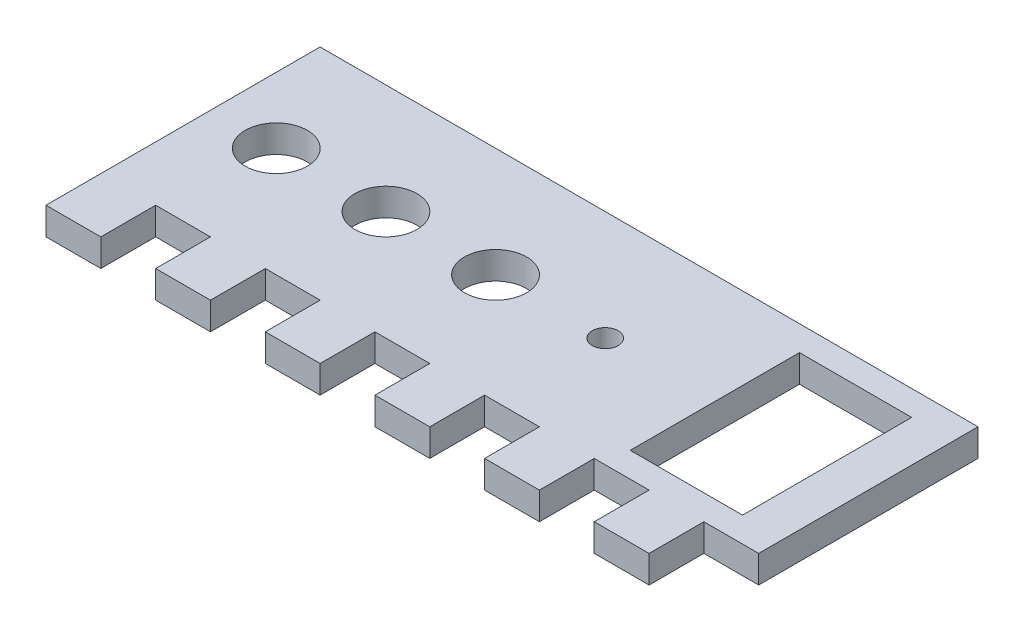
ISO-10303-21;
HEADER;
FILE_DESCRIPTION(('STEP AP214'),'2;1');
FILE_NAME('part.step','',(''),(''),'','','');
FILE_SCHEMA(('AUTOMOTIVE_DESIGN { 1 0 10303 214 1 1 1 1 }'));
ENDSEC;
DATA;
#1=APPLICATION_CONTEXT('core data for automotive mechanical design processes');
#2=APPLICATION_PROTOCOL_DEFINITION('international standard','automotive_design',2000,#1);
#3=PRODUCT_CONTEXT('',#1,'mechanical');
#4=PRODUCT('Part','Part','',(#3));
#5=PRODUCT_RELATED_PRODUCT_CATEGORY('part','',(#4));
#6=PRODUCT_DEFINITION_FORMATION('','',#4);
#7=PRODUCT_DEFINITION_CONTEXT('part definition',#1,'design');
#8=PRODUCT_DEFINITION('design','',#6,#7);
#9=PRODUCT_DEFINITION_SHAPE('','',#8);
#10=(LENGTH_UNIT() NAMED_UNIT(*) SI_UNIT(.MILLI.,.METRE.));
#11=(NAMED_UNIT(*) PLANE_ANGLE_UNIT() SI_UNIT($,.RADIAN.));
#12=(NAMED_UNIT(*) SI_UNIT($,.STERADIAN.) SOLID_ANGLE_UNIT());
#13=UNCERTAINTY_MEASURE_WITH_UNIT(LENGTH_MEASURE(1.E-05),#10,'distance_accuracy_value','');
#14=(GEOMETRIC_REPRESENTATION_CONTEXT(3) GLOBAL_UNCERTAINTY_ASSIGNED_CONTEXT((#13)) GLOBAL_UNIT_ASSIGNED_CONTEXT((#10,
#11,#12)) REPRESENTATION_CONTEXT('',''));
#15=CARTESIAN_POINT('',(0.,0.,0.));
#16=DIRECTION('',(0.,0.,1.));
#17=DIRECTION('',(1.,0.,0.));
#18=AXIS2_PLACEMENT_3D('',#15,#16,#17);
#19=CARTESIAN_POINT('',(0.,3.175,0.));
#20=DIRECTION('',(0.,-1.,0.));
#21=DIRECTION('',(0.,0.,-1.));
#22=AXIS2_PLACEMENT_3D('',#19,#20,#21);
#23=PLANE('',#22);
#24=CARTESIAN_POINT('',(7.62,3.175,-12.7));
#25=DIRECTION('',(0.,1.,0.));
#26=DIRECTION('',(0.,0.,1.));
#27=AXIS2_PLACEMENT_3D('',#24,#25,#26);
#28=CIRCLE('',#27,3.6);
#29=CARTESIAN_POINT('',(7.62,3.175,-9.1));
#30=VERTEX_POINT('',#29);
#31=EDGE_CURVE('E270',#30,#30,#28,.T.);
#32=ORIENTED_EDGE('',*,*,#31,.F.);
#33=EDGE_LOOP('',(#32));
#34=FACE_BOUND('',#33,.T.);
#35=CARTESIAN_POINT('',(45.72,3.175,-12.7));
#36=DIRECTION('',(0.,1.,0.));
#37=DIRECTION('',(0.,0.,1.));
#38=AXIS2_PLACEMENT_3D('',#35,#36,#37);
#39=CIRCLE('',#38,1.5);
#40=CARTESIAN_POINT('',(45.72,3.175,-11.2));
#41=VERTEX_POINT('',#40);
#42=EDGE_CURVE('E276',#41,#41,#39,.T.);
#43=ORIENTED_EDGE('',*,*,#42,.F.);
#44=EDGE_LOOP('',(#43));
#45=FACE_BOUND('',#44,.T.);
#46=CARTESIAN_POINT('',(33.02,3.175,-12.7));
#47=DIRECTION('',(0.,1.,0.));
#48=DIRECTION('',(0.,0.,1.));
#49=AXIS2_PLACEMENT_3D('',#46,#47,#48);
#50=CIRCLE('',#49,3.6);
#51=CARTESIAN_POINT('',(33.02,3.175,-9.1));
#52=VERTEX_POINT('',#51);
#53=EDGE_CURVE('E282',#52,#52,#50,.T.);
#54=ORIENTED_EDGE('',*,*,#53,.F.);
#55=EDGE_LOOP('',(#54));
#56=FACE_BOUND('',#55,.T.);
#57=CARTESIAN_POINT('',(20.32,3.175,-12.7));
#58=DIRECTION('',(0.,1.,0.));
#59=DIRECTION('',(0.,0.,1.));
#60=AXIS2_PLACEMENT_3D('',#57,#58,#59);
#61=CIRCLE('',#60,3.6);
#62=CARTESIAN_POINT('',(20.32,3.175,-9.1));
#63=VERTEX_POINT('',#62);
#64=EDGE_CURVE('E288',#63,#63,#61,.T.);
#65=ORIENTED_EDGE('',*,*,#64,.F.);
#66=EDGE_LOOP('',(#65));
#67=FACE_BOUND('',#66,.T.);
#68=DIRECTION('',(0.,0.,1.));
#69=VECTOR('',#68,1.);
#70=CARTESIAN_POINT('',(0.,3.175,0.));
#71=LINE('',#70,#69);
#72=CARTESIAN_POINT('',(0.,3.175,-25.4));
#73=VERTEX_POINT('',#72);
#74=CARTESIAN_POINT('',(0.,3.175,6.35));
#75=VERTEX_POINT('',#74);
#76=EDGE_CURVE('E294',#73,#75,#71,.T.);
#77=ORIENTED_EDGE('',*,*,#76,.T.);
#78=DIRECTION('',(1.,0.,0.));
#79=VECTOR('',#78,1.);
#80=CARTESIAN_POINT('',(0.,3.175,6.35));
#81=LINE('',#80,#79);
#82=CARTESIAN_POINT('',(6.35,3.175,6.35));
#83=VERTEX_POINT('',#82);
#84=EDGE_CURVE('E296',#75,#83,#81,.T.);
#85=ORIENTED_EDGE('',*,*,#84,.T.);
#86=DIRECTION('',(0.,0.,-1.));
#87=VECTOR('',#86,1.);
#88=CARTESIAN_POINT('',(6.35,3.175,6.35));
#89=LINE('',#88,#87);
#90=CARTESIAN_POINT('',(6.35,3.175,0.));
#91=VERTEX_POINT('',#90);
#92=EDGE_CURVE('E299',#83,#91,#89,.T.);
#93=ORIENTED_EDGE('',*,*,#92,.T.);
#94=DIRECTION('',(1.,0.,0.));
#95=VECTOR('',#94,1.);
#96=CARTESIAN_POINT('',(6.35,3.175,0.));
#97=LINE('',#96,#95);
#98=CARTESIAN_POINT('',(12.7,3.175,0.));
#99=VERTEX_POINT('',#98);
#100=EDGE_CURVE('E301',#91,#99,#97,.T.);
#101=ORIENTED_EDGE('',*,*,#100,.T.);
#102=DIRECTION('',(0.,0.,1.));
#103=VECTOR('',#102,1.);
#104=CARTESIAN_POINT('',(12.7,3.175,0.));
#105=LINE('',#104,#103);
#106=CARTESIAN_POINT('',(12.7,3.175,6.35));
#107=VERTEX_POINT('',#106);
#108=EDGE_CURVE('E303',#99,#107,#105,.T.);
#109=ORIENTED_EDGE('',*,*,#108,.T.);
#110=DIRECTION('',(1.,0.,0.));
#111=VECTOR('',#110,1.);
#112=CARTESIAN_POINT('',(12.7,3.175,6.35));
#113=LINE('',#112,#111);
#114=CARTESIAN_POINT('',(19.05,3.175,6.35));
#115=VERTEX_POINT('',#114);
#116=EDGE_CURVE('E305',#107,#115,#113,.T.);
#117=ORIENTED_EDGE('',*,*,#116,.T.);
#118=DIRECTION('',(0.,0.,-1.));
#119=VECTOR('',#118,1.);
#120=CARTESIAN_POINT('',(19.05,3.175,6.35));
#121=LINE('',#120,#119);
#122=CARTESIAN_POINT('',(19.05,3.175,0.));
#123=VERTEX_POINT('',#122);
#124=EDGE_CURVE('E307',#115,#123,#121,.T.);
#125=ORIENTED_EDGE('',*,*,#124,.T.);
#126=DIRECTION('',(1.,0.,0.));
#127=VECTOR('',#126,1.);
#128=CARTESIAN_POINT('',(19.05,3.175,0.));
#129=LINE('',#128,#127);
#130=CARTESIAN_POINT('',(25.4,3.175,0.));
#131=VERTEX_POINT('',#130);
#132=EDGE_CURVE('E309',#123,#131,#129,.T.);
#133=ORIENTED_EDGE('',*,*,#132,.T.);
#134=DIRECTION('',(0.,0.,1.));
#135=VECTOR('',#134,1.);
#136=CARTESIAN_POINT('',(25.4,3.175,0.));
#137=LINE('',#136,#135);
#138=CARTESIAN_POINT('',(25.4,3.175,6.35));
#139=VERTEX_POINT('',#138);
#140=EDGE_CURVE('E311',#131,#139,#137,.T.);
#141=ORIENTED_EDGE('',*,*,#140,.T.);
#142=DIRECTION('',(1.,0.,0.));
#143=VECTOR('',#142,1.);
#144=CARTESIAN_POINT('',(25.4,3.175,6.35));
#145=LINE('',#144,#143);
#146=CARTESIAN_POINT('',(31.75,3.175,6.35));
#147=VERTEX_POINT('',#146);
#148=EDGE_CURVE('E313',#139,#147,#145,.T.);
#149=ORIENTED_EDGE('',*,*,#148,.T.);
#150=DIRECTION('',(0.,0.,-1.));
#151=VECTOR('',#150,1.);
#152=CARTESIAN_POINT('',(31.75,3.175,6.35));
#153=LINE('',#152,#151);
#154=CARTESIAN_POINT('',(31.75,3.175,0.));
#155=VERTEX_POINT('',#154);
#156=EDGE_CURVE('E315',#147,#155,#153,.T.);
#157=ORIENTED_EDGE('',*,*,#156,.T.);
#158=DIRECTION('',(1.,0.,0.));
#159=VECTOR('',#158,1.);
#160=CARTESIAN_POINT('',(31.75,3.175,0.));
#161=LINE('',#160,#159);
#162=CARTESIAN_POINT('',(38.1,3.175,0.));
#163=VERTEX_POINT('',#162);
#164=EDGE_CURVE('E317',#155,#163,#161,.T.);
#165=ORIENTED_EDGE('',*,*,#164,.T.);
#166=DIRECTION('',(0.,0.,1.));
#167=VECTOR('',#166,1.);
#168=CARTESIAN_POINT('',(38.1,3.175,0.));
#169=LINE('',#168,#167);
#170=CARTESIAN_POINT('',(38.1,3.175,6.35));
#171=VERTEX_POINT('',#170);
#172=EDGE_CURVE('E319',#163,#171,#169,.T.);
#173=ORIENTED_EDGE('',*,*,#172,.T.);
#174=DIRECTION('',(1.,0.,0.));
#175=VECTOR('',#174,1.);
#176=CARTESIAN_POINT('',(38.1,3.175,6.35));
#177=LINE('',#176,#175);
#178=CARTESIAN_POINT('',(44.45,3.175,6.35));
#179=VERTEX_POINT('',#178);
#180=EDGE_CURVE('E321',#171,#179,#177,.T.);
#181=ORIENTED_EDGE('',*,*,#180,.T.);
#182=DIRECTION('',(0.,0.,-1.));
#183=VECTOR('',#182,1.);
#184=CARTESIAN_POINT('',(44.45,3.175,6.35));
#185=LINE('',#184,#183);
#186=CARTESIAN_POINT('',(44.45,3.175,0.));
#187=VERTEX_POINT('',#186);
#188=EDGE_CURVE('E323',#179,#187,#185,.T.);
#189=ORIENTED_EDGE('',*,*,#188,.T.);
#190=DIRECTION('',(1.,0.,0.));
#191=VECTOR('',#190,1.);
#192=CARTESIAN_POINT('',(44.45,3.175,0.));
#193=LINE('',#192,#191);
#194=CARTESIAN_POINT('',(50.8,3.175,0.));
#195=VERTEX_POINT('',#194);
#196=EDGE_CURVE('E325',#187,#195,#193,.T.);
#197=ORIENTED_EDGE('',*,*,#196,.T.);
#198=DIRECTION('',(0.,0.,1.));
#199=VECTOR('',#198,1.);
#200=CARTESIAN_POINT('',(50.8,3.175,0.));
#201=LINE('',#200,#199);
#202=CARTESIAN_POINT('',(50.8,3.175,6.35));
#203=VERTEX_POINT('',#202);
#204=EDGE_CURVE('E327',#195,#203,#201,.T.);
#205=ORIENTED_EDGE('',*,*,#204,.T.);
#206=DIRECTION('',(1.,0.,0.));
#207=VECTOR('',#206,1.);
#208=CARTESIAN_POINT('',(50.8,3.175,6.35));
#209=LINE('',#208,#207);
#210=CARTESIAN_POINT('',(57.15,3.175,6.35));
#211=VERTEX_POINT('',#210);
#212=EDGE_CURVE('E329',#203,#211,#209,.T.);
#213=ORIENTED_EDGE('',*,*,#212,.T.);
#214=DIRECTION('',(0.,0.,-1.));
#215=VECTOR('',#214,1.);
#216=CARTESIAN_POINT('',(57.15,3.175,6.35));
#217=LINE('',#216,#215);
#218=CARTESIAN_POINT('',(57.15,3.175,0.));
#219=VERTEX_POINT('',#218);
#220=EDGE_CURVE('E331',#211,#219,#217,.T.);
#221=ORIENTED_EDGE('',*,*,#220,.T.);
#222=DIRECTION('',(1.,0.,0.));
#223=VECTOR('',#222,1.);
#224=CARTESIAN_POINT('',(57.15,3.175,0.));
#225=LINE('',#224,#223);
#226=CARTESIAN_POINT('',(63.5,3.175,0.));
#227=VERTEX_POINT('',#226);
#228=EDGE_CURVE('E333',#219,#227,#225,.T.);
#229=ORIENTED_EDGE('',*,*,#228,.T.);
#230=DIRECTION('',(0.,0.,1.));
#231=VECTOR('',#230,1.);
#232=CARTESIAN_POINT('',(63.5,3.175,0.));
#233=LINE('',#232,#231);
#234=CARTESIAN_POINT('',(63.5,3.175,6.35));
#235=VERTEX_POINT('',#234);
#236=EDGE_CURVE('E335',#227,#235,#233,.T.);
#237=ORIENTED_EDGE('',*,*,#236,.T.);
#238=DIRECTION('',(1.,0.,0.));
#239=VECTOR('',#238,1.);
#240=CARTESIAN_POINT('',(63.5,3.175,6.35));
#241=LINE('',#240,#239);
#242=CARTESIAN_POINT('',(69.85,3.175,6.35));
#243=VERTEX_POINT('',#242);
#244=EDGE_CURVE('E337',#235,#243,#241,.T.);
#245=ORIENTED_EDGE('',*,*,#244,.T.);
#246=DIRECTION('',(0.,0.,-1.));
#247=VECTOR('',#246,1.);
#248=CARTESIAN_POINT('',(69.85,3.175,6.35));
#249=LINE('',#248,#247);
#250=CARTESIAN_POINT('',(69.85,3.175,0.));
#251=VERTEX_POINT('',#250);
#252=EDGE_CURVE('E339',#243,#251,#249,.T.);
#253=ORIENTED_EDGE('',*,*,#252,.T.);
#254=DIRECTION('',(1.,0.,0.));
#255=VECTOR('',#254,1.);
#256=CARTESIAN_POINT('',(69.85,3.175,0.));
#257=LINE('',#256,#255);
#258=CARTESIAN_POINT('',(76.2,3.175,0.));
#259=VERTEX_POINT('',#258);
#260=EDGE_CURVE('E341',#251,#259,#257,.T.);
#261=ORIENTED_EDGE('',*,*,#260,.T.);
#262=DIRECTION('',(0.,0.,-1.));
#263=VECTOR('',#262,1.);
#264=CARTESIAN_POINT('',(76.2,3.175,0.));
#265=LINE('',#264,#263);
#266=CARTESIAN_POINT('',(76.2,3.175,-25.4));
#267=VERTEX_POINT('',#266);
#268=EDGE_CURVE('E343',#259,#267,#265,.T.);
#269=ORIENTED_EDGE('',*,*,#268,.T.);
#270=DIRECTION('',(-1.,0.,0.));
#271=VECTOR('',#270,1.);
#272=CARTESIAN_POINT('',(0.,3.175,-25.4));
#273=LINE('',#272,#271);
#274=EDGE_CURVE('E345',#267,#73,#273,.T.);
#275=ORIENTED_EDGE('',*,*,#274,.T.);
#276=EDGE_LOOP('',(#77,#85,#93,#101,#109,#117,#125,#133,#141,#149,#157,#165,#173,#181,#189,#197,
#205,#213,#221,#229,#237,#245,#253,#261,#269,#275));
#277=FACE_BOUND('',#276,.T.);
#278=DIRECTION('',(0.,0.,1.));
#279=VECTOR('',#278,1.);
#280=CARTESIAN_POINT('',(58.42,3.175,-22.5));
#281=LINE('',#280,#279);
#282=CARTESIAN_POINT('',(58.42,3.175,-22.5));
#283=VERTEX_POINT('',#282);
#284=CARTESIAN_POINT('',(58.42,3.175,-2.9));
#285=VERTEX_POINT('',#284);
#286=EDGE_CURVE('E234',#283,#285,#281,.T.);
#287=ORIENTED_EDGE('',*,*,#286,.F.);
#288=DIRECTION('',(-1.,0.,0.));
#289=VECTOR('',#288,1.);
#290=CARTESIAN_POINT('',(58.42,3.175,-22.5));
#291=LINE('',#290,#289);
#292=CARTESIAN_POINT('',(71.42,3.175,-22.5));
#293=VERTEX_POINT('',#292);
#294=EDGE_CURVE('E256',#293,#283,#291,.T.);
#295=ORIENTED_EDGE('',*,*,#294,.F.);
#296=DIRECTION('',(0.,0.,-1.));
#297=VECTOR('',#296,1.);
#298=CARTESIAN_POINT('',(71.42,3.175,-22.5));
#299=LINE('',#298,#297);
#300=CARTESIAN_POINT('',(71.42,3.175,-2.9));
#301=VERTEX_POINT('',#300);
#302=EDGE_CURVE('E254',#301,#293,#299,.T.);
#303=ORIENTED_EDGE('',*,*,#302,.F.);
#304=DIRECTION('',(1.,0.,0.));
#305=VECTOR('',#304,1.);
#306=CARTESIAN_POINT('',(58.42,3.175,-2.9));
#307=LINE('',#306,#305);
#308=EDGE_CURVE('E242',#285,#301,#307,.T.);
#309=ORIENTED_EDGE('',*,*,#308,.F.);
#310=EDGE_LOOP('',(#287,#295,#303,#309));
#311=FACE_BOUND('',#310,.T.);
#312=ADVANCED_FACE('F37',(#34,#45,#56,#67,#277,#311),#23,.F.);
#313=CARTESIAN_POINT('',(0.,0.,0.));
#314=DIRECTION('',(0.,-1.,0.));
#315=DIRECTION('',(0.,0.,-1.));
#316=AXIS2_PLACEMENT_3D('',#313,#314,#315);
#317=PLANE('',#316);
#318=CARTESIAN_POINT('',(45.72,0.,-12.7));
#319=DIRECTION('',(0.,1.,0.));
#320=DIRECTION('',(0.,0.,1.));
#321=AXIS2_PLACEMENT_3D('',#318,#319,#320);
#322=CIRCLE('',#321,1.5);
#323=CARTESIAN_POINT('',(45.72,0.,-11.2));
#324=VERTEX_POINT('',#323);
#325=EDGE_CURVE('E273',#324,#324,#322,.T.);
#326=ORIENTED_EDGE('',*,*,#325,.T.);
#327=EDGE_LOOP('',(#326));
#328=FACE_BOUND('',#327,.T.);
#329=CARTESIAN_POINT('',(20.32,0.,-12.7));
#330=DIRECTION('',(0.,1.,0.));
#331=DIRECTION('',(0.,0.,1.));
#332=AXIS2_PLACEMENT_3D('',#329,#330,#331);
#333=CIRCLE('',#332,3.6);
#334=CARTESIAN_POINT('',(20.32,0.,-9.1));
#335=VERTEX_POINT('',#334);
#336=EDGE_CURVE('E285',#335,#335,#333,.T.);
#337=ORIENTED_EDGE('',*,*,#336,.T.);
#338=EDGE_LOOP('',(#337));
#339=FACE_BOUND('',#338,.T.);
#340=DIRECTION('',(0.,0.,1.));
#341=VECTOR('',#340,1.);
#342=CARTESIAN_POINT('',(0.,0.,0.));
#343=LINE('',#342,#341);
#344=CARTESIAN_POINT('',(0.,0.,-25.4));
#345=VERTEX_POINT('',#344);
#346=CARTESIAN_POINT('',(0.,0.,6.35));
#347=VERTEX_POINT('',#346);
#348=EDGE_CURVE('E291',#345,#347,#343,.T.);
#349=ORIENTED_EDGE('',*,*,#348,.F.);
#350=DIRECTION('',(-1.,0.,0.));
#351=VECTOR('',#350,1.);
#352=CARTESIAN_POINT('',(0.,0.,-25.4));
#353=LINE('',#352,#351);
#354=CARTESIAN_POINT('',(76.2,0.,-25.4));
#355=VERTEX_POINT('',#354);
#356=EDGE_CURVE('E297',#355,#345,#353,.T.);
#357=ORIENTED_EDGE('',*,*,#356,.F.);
#358=DIRECTION('',(0.,0.,-1.));
#359=VECTOR('',#358,1.);
#360=CARTESIAN_POINT('',(76.2,0.,0.));
#361=LINE('',#360,#359);
#362=CARTESIAN_POINT('',(76.2,0.,0.));
#363=VERTEX_POINT('',#362);
#364=EDGE_CURVE('E395',#363,#355,#361,.T.);
#365=ORIENTED_EDGE('',*,*,#364,.F.);
#366=DIRECTION('',(1.,0.,0.));
#367=VECTOR('',#366,1.);
#368=CARTESIAN_POINT('',(69.85,0.,0.));
#369=LINE('',#368,#367);
#370=CARTESIAN_POINT('',(69.85,0.,0.));
#371=VERTEX_POINT('',#370);
#372=EDGE_CURVE('E393',#371,#363,#369,.T.);
#373=ORIENTED_EDGE('',*,*,#372,.F.);
#374=DIRECTION('',(0.,0.,-1.));
#375=VECTOR('',#374,1.);
#376=CARTESIAN_POINT('',(69.85,0.,6.35));
#377=LINE('',#376,#375);
#378=CARTESIAN_POINT('',(69.85,0.,6.35));
#379=VERTEX_POINT('',#378);
#380=EDGE_CURVE('E391',#379,#371,#377,.T.);
#381=ORIENTED_EDGE('',*,*,#380,.F.);
#382=DIRECTION('',(1.,0.,0.));
#383=VECTOR('',#382,1.);
#384=CARTESIAN_POINT('',(63.5,0.,6.35));
#385=LINE('',#384,#383);
#386=CARTESIAN_POINT('',(63.5,0.,6.35));
#387=VERTEX_POINT('',#386);
#388=EDGE_CURVE('E389',#387,#379,#385,.T.);
#389=ORIENTED_EDGE('',*,*,#388,.F.);
#390=DIRECTION('',(0.,0.,1.));
#391=VECTOR('',#390,1.);
#392=CARTESIAN_POINT('',(63.5,0.,0.));
#393=LINE('',#392,#391);
#394=CARTESIAN_POINT('',(63.5,0.,0.));
#395=VERTEX_POINT('',#394);
#396=EDGE_CURVE('E387',#395,#387,#393,.T.);
#397=ORIENTED_EDGE('',*,*,#396,.F.);
#398=DIRECTION('',(1.,0.,0.));
#399=VECTOR('',#398,1.);
#400=CARTESIAN_POINT('',(57.15,0.,0.));
#401=LINE('',#400,#399);
#402=CARTESIAN_POINT('',(57.15,0.,0.));
#403=VERTEX_POINT('',#402);
#404=EDGE_CURVE('E385',#403,#395,#401,.T.);
#405=ORIENTED_EDGE('',*,*,#404,.F.);
#406=DIRECTION('',(0.,0.,-1.));
#407=VECTOR('',#406,1.);
#408=CARTESIAN_POINT('',(57.15,0.,6.35));
#409=LINE('',#408,#407);
#410=CARTESIAN_POINT('',(57.15,0.,6.35));
#411=VERTEX_POINT('',#410);
#412=EDGE_CURVE('E383',#411,#403,#409,.T.);
#413=ORIENTED_EDGE('',*,*,#412,.F.);
#414=DIRECTION('',(1.,0.,0.));
#415=VECTOR('',#414,1.);
#416=CARTESIAN_POINT('',(50.8,0.,6.35));
#417=LINE('',#416,#415);
#418=CARTESIAN_POINT('',(50.8,0.,6.35));
#419=VERTEX_POINT('',#418);
#420=EDGE_CURVE('E381',#419,#411,#417,.T.);
#421=ORIENTED_EDGE('',*,*,#420,.F.);
#422=DIRECTION('',(0.,0.,1.));
#423=VECTOR('',#422,1.);
#424=CARTESIAN_POINT('',(50.8,0.,0.));
#425=LINE('',#424,#423);
#426=CARTESIAN_POINT('',(50.8,0.,0.));
#427=VERTEX_POINT('',#426);
#428=EDGE_CURVE('E379',#427,#419,#425,.T.);
#429=ORIENTED_EDGE('',*,*,#428,.F.);
#430=DIRECTION('',(1.,0.,0.));
#431=VECTOR('',#430,1.);
#432=CARTESIAN_POINT('',(44.45,0.,0.));
#433=LINE('',#432,#431);
#434=CARTESIAN_POINT('',(44.45,0.,0.));
#435=VERTEX_POINT('',#434);
#436=EDGE_CURVE('E377',#435,#427,#433,.T.);
#437=ORIENTED_EDGE('',*,*,#436,.F.);
#438=DIRECTION('',(0.,0.,-1.));
#439=VECTOR('',#438,1.);
#440=CARTESIAN_POINT('',(44.45,0.,6.35));
#441=LINE('',#440,#439);
#442=CARTESIAN_POINT('',(44.45,0.,6.35));
#443=VERTEX_POINT('',#442);
#444=EDGE_CURVE('E375',#443,#435,#441,.T.);
#445=ORIENTED_EDGE('',*,*,#444,.F.);
#446=DIRECTION('',(1.,0.,0.));
#447=VECTOR('',#446,1.);
#448=CARTESIAN_POINT('',(38.1,0.,6.35));
#449=LINE('',#448,#447);
#450=CARTESIAN_POINT('',(38.1,0.,6.35));
#451=VERTEX_POINT('',#450);
#452=EDGE_CURVE('E373',#451,#443,#449,.T.);
#453=ORIENTED_EDGE('',*,*,#452,.F.);
#454=DIRECTION('',(0.,0.,1.));
#455=VECTOR('',#454,1.);
#456=CARTESIAN_POINT('',(38.1,0.,0.));
#457=LINE('',#456,#455);
#458=CARTESIAN_POINT('',(38.1,0.,0.));
#459=VERTEX_POINT('',#458);
#460=EDGE_CURVE('E371',#459,#451,#457,.T.);
#461=ORIENTED_EDGE('',*,*,#460,.F.);
#462=DIRECTION('',(1.,0.,0.));
#463=VECTOR('',#462,1.);
#464=CARTESIAN_POINT('',(31.75,0.,0.));
#465=LINE('',#464,#463);
#466=CARTESIAN_POINT('',(31.75,0.,0.));
#467=VERTEX_POINT('',#466);
#468=EDGE_CURVE('E369',#467,#459,#465,.T.);
#469=ORIENTED_EDGE('',*,*,#468,.F.);
#470=DIRECTION('',(0.,0.,-1.));
#471=VECTOR('',#470,1.);
#472=CARTESIAN_POINT('',(31.75,0.,6.35));
#473=LINE('',#472,#471);
#474=CARTESIAN_POINT('',(31.75,0.,6.35));
#475=VERTEX_POINT('',#474);
#476=EDGE_CURVE('E367',#475,#467,#473,.T.);
#477=ORIENTED_EDGE('',*,*,#476,.F.);
#478=DIRECTION('',(1.,0.,0.));
#479=VECTOR('',#478,1.);
#480=CARTESIAN_POINT('',(25.4,0.,6.35));
#481=LINE('',#480,#479);
#482=CARTESIAN_POINT('',(25.4,0.,6.35));
#483=VERTEX_POINT('',#482);
#484=EDGE_CURVE('E365',#483,#475,#481,.T.);
#485=ORIENTED_EDGE('',*,*,#484,.F.);
#486=DIRECTION('',(0.,0.,1.));
#487=VECTOR('',#486,1.);
#488=CARTESIAN_POINT('',(25.4,0.,0.));
#489=LINE('',#488,#487);
#490=CARTESIAN_POINT('',(25.4,0.,0.));
#491=VERTEX_POINT('',#490);
#492=EDGE_CURVE('E363',#491,#483,#489,.T.);
#493=ORIENTED_EDGE('',*,*,#492,.F.);
#494=DIRECTION('',(1.,0.,0.));
#495=VECTOR('',#494,1.);
#496=CARTESIAN_POINT('',(19.05,0.,0.));
#497=LINE('',#496,#495);
#498=CARTESIAN_POINT('',(19.05,0.,0.));
#499=VERTEX_POINT('',#498);
#500=EDGE_CURVE('E361',#499,#491,#497,.T.);
#501=ORIENTED_EDGE('',*,*,#500,.F.);
#502=DIRECTION('',(0.,0.,-1.));
#503=VECTOR('',#502,1.);
#504=CARTESIAN_POINT('',(19.05,0.,6.35));
#505=LINE('',#504,#503);
#506=CARTESIAN_POINT('',(19.05,0.,6.35));
#507=VERTEX_POINT('',#506);
#508=EDGE_CURVE('E359',#507,#499,#505,.T.);
#509=ORIENTED_EDGE('',*,*,#508,.F.);
#510=DIRECTION('',(1.,0.,0.));
#511=VECTOR('',#510,1.);
#512=CARTESIAN_POINT('',(12.7,0.,6.35));
#513=LINE('',#512,#511);
#514=CARTESIAN_POINT('',(12.7,0.,6.35));
#515=VERTEX_POINT('',#514);
#516=EDGE_CURVE('E357',#515,#507,#513,.T.);
#517=ORIENTED_EDGE('',*,*,#516,.F.);
#518=DIRECTION('',(0.,0.,1.));
#519=VECTOR('',#518,1.);
#520=CARTESIAN_POINT('',(12.7,0.,0.));
#521=LINE('',#520,#519);
#522=CARTESIAN_POINT('',(12.7,0.,0.));
#523=VERTEX_POINT('',#522);
#524=EDGE_CURVE('E355',#523,#515,#521,.T.);
#525=ORIENTED_EDGE('',*,*,#524,.F.);
#526=DIRECTION('',(1.,0.,0.));
#527=VECTOR('',#526,1.);
#528=CARTESIAN_POINT('',(6.35,0.,0.));
#529=LINE('',#528,#527);
#530=CARTESIAN_POINT('',(6.35,0.,0.));
#531=VERTEX_POINT('',#530);
#532=EDGE_CURVE('E353',#531,#523,#529,.T.);
#533=ORIENTED_EDGE('',*,*,#532,.F.);
#534=DIRECTION('',(0.,0.,-1.));
#535=VECTOR('',#534,1.);
#536=CARTESIAN_POINT('',(6.35,0.,6.35));
#537=LINE('',#536,#535);
#538=CARTESIAN_POINT('',(6.35,0.,6.35));
#539=VERTEX_POINT('',#538);
#540=EDGE_CURVE('E351',#539,#531,#537,.T.);
#541=ORIENTED_EDGE('',*,*,#540,.F.);
#542=DIRECTION('',(1.,0.,0.));
#543=VECTOR('',#542,1.);
#544=CARTESIAN_POINT('',(0.,0.,6.35));
#545=LINE('',#544,#543);
#546=EDGE_CURVE('E349',#347,#539,#545,.T.);
#547=ORIENTED_EDGE('',*,*,#546,.F.);
#548=EDGE_LOOP('',(#349,#357,#365,#373,#381,#389,#397,#405,#413,#421,#429,#437,#445,#453,#461,
#469,#477,#485,#493,#501,#509,#517,#525,#533,#541,#547));
#549=FACE_BOUND('',#548,.T.);
#550=CARTESIAN_POINT('',(33.02,0.,-12.7));
#551=DIRECTION('',(0.,1.,0.));
#552=DIRECTION('',(0.,0.,1.));
#553=AXIS2_PLACEMENT_3D('',#550,#551,#552);
#554=CIRCLE('',#553,3.6);
#555=CARTESIAN_POINT('',(33.02,0.,-9.1));
#556=VERTEX_POINT('',#555);
#557=EDGE_CURVE('E279',#556,#556,#554,.T.);
#558=ORIENTED_EDGE('',*,*,#557,.T.);
#559=EDGE_LOOP('',(#558));
#560=FACE_BOUND('',#559,.T.);
#561=CARTESIAN_POINT('',(7.62,0.,-12.7));
#562=DIRECTION('',(0.,1.,0.));
#563=DIRECTION('',(0.,0.,1.));
#564=AXIS2_PLACEMENT_3D('',#561,#562,#563);
#565=CIRCLE('',#564,3.6);
#566=CARTESIAN_POINT('',(7.62,0.,-9.1));
#567=VERTEX_POINT('',#566);
#568=EDGE_CURVE('E250',#567,#567,#565,.T.);
#569=ORIENTED_EDGE('',*,*,#568,.T.);
#570=EDGE_LOOP('',(#569));
#571=FACE_BOUND('',#570,.T.);
#572=DIRECTION('',(-1.,0.,0.));
#573=VECTOR('',#572,1.);
#574=CARTESIAN_POINT('',(58.42,0.,-22.5));
#575=LINE('',#574,#573);
#576=CARTESIAN_POINT('',(71.42,0.,-22.5));
#577=VERTEX_POINT('',#576);
#578=CARTESIAN_POINT('',(58.42,0.,-22.5));
#579=VERTEX_POINT('',#578);
#580=EDGE_CURVE('E243',#577,#579,#575,.T.);
#581=ORIENTED_EDGE('',*,*,#580,.T.);
#582=DIRECTION('',(0.,0.,1.));
#583=VECTOR('',#582,1.);
#584=CARTESIAN_POINT('',(58.42,0.,-22.5));
#585=LINE('',#584,#583);
#586=CARTESIAN_POINT('',(58.42,0.,-2.9));
#587=VERTEX_POINT('',#586);
#588=EDGE_CURVE('E60',#579,#587,#585,.T.);
#589=ORIENTED_EDGE('',*,*,#588,.T.);
#590=DIRECTION('',(1.,0.,0.));
#591=VECTOR('',#590,1.);
#592=CARTESIAN_POINT('',(58.42,0.,-2.9));
#593=LINE('',#592,#591);
#594=CARTESIAN_POINT('',(71.42,0.,-2.9));
#595=VERTEX_POINT('',#594);
#596=EDGE_CURVE('E249',#587,#595,#593,.T.);
#597=ORIENTED_EDGE('',*,*,#596,.T.);
#598=DIRECTION('',(0.,0.,-1.));
#599=VECTOR('',#598,1.);
#600=CARTESIAN_POINT('',(71.42,0.,-22.5));
#601=LINE('',#600,#599);
#602=EDGE_CURVE('E262',#595,#577,#601,.T.);
#603=ORIENTED_EDGE('',*,*,#602,.T.);
#604=EDGE_LOOP('',(#581,#589,#597,#603));
#605=FACE_BOUND('',#604,.T.);
#606=ADVANCED_FACE('F481',(#328,#339,#549,#560,#571,#605),#317,.T.);
#607=CARTESIAN_POINT('',(0.,3.175,0.));
#608=DIRECTION('',(1.,0.,0.));
#609=DIRECTION('',(0.,0.,-1.));
#610=AXIS2_PLACEMENT_3D('',#607,#608,#609);
#611=PLANE('',#610);
#612=ORIENTED_EDGE('',*,*,#348,.T.);
#613=DIRECTION('',(0.,-1.,0.));
#614=VECTOR('',#613,1.);
#615=CARTESIAN_POINT('',(0.,3.175,6.35));
#616=LINE('',#615,#614);
#617=EDGE_CURVE('E11',#75,#347,#616,.T.);
#618=ORIENTED_EDGE('',*,*,#617,.F.);
#619=ORIENTED_EDGE('',*,*,#76,.F.);
#620=DIRECTION('',(0.,-1.,0.));
#621=VECTOR('',#620,1.);
#622=CARTESIAN_POINT('',(0.,3.175,-25.4));
#623=LINE('',#622,#621);
#624=EDGE_CURVE('E347',#73,#345,#623,.T.);
#625=ORIENTED_EDGE('',*,*,#624,.T.);
#626=EDGE_LOOP('',(#612,#618,#619,#625));
#627=FACE_BOUND('',#626,.T.);
#628=ADVANCED_FACE('F39',(#627),#611,.F.);
#629=CARTESIAN_POINT('',(0.,3.175,6.35));
#630=DIRECTION('',(0.,0.,-1.));
#631=DIRECTION('',(-1.,0.,0.));
#632=AXIS2_PLACEMENT_3D('',#629,#630,#631);
#633=PLANE('',#632);
#634=ORIENTED_EDGE('',*,*,#546,.T.);
#635=DIRECTION('',(0.,-1.,0.));
#636=VECTOR('',#635,1.);
#637=CARTESIAN_POINT('',(6.35,3.175,6.35));
#638=LINE('',#637,#636);
#639=EDGE_CURVE('E45',#83,#539,#638,.T.);
#640=ORIENTED_EDGE('',*,*,#639,.F.);
#641=ORIENTED_EDGE('',*,*,#84,.F.);
#642=ORIENTED_EDGE('',*,*,#617,.T.);
#643=EDGE_LOOP('',(#634,#640,#641,#642));
#644=FACE_BOUND('',#643,.T.);
#645=ADVANCED_FACE('F498',(#644),#633,.F.);
#646=CARTESIAN_POINT('',(6.35,3.175,6.35));
#647=DIRECTION('',(-1.,0.,0.));
#648=DIRECTION('',(0.,0.,1.));
#649=AXIS2_PLACEMENT_3D('',#646,#647,#648);
#650=PLANE('',#649);
#651=ORIENTED_EDGE('',*,*,#540,.T.);
#652=DIRECTION('',(0.,-1.,0.));
#653=VECTOR('',#652,1.);
#654=CARTESIAN_POINT('',(6.35,3.175,0.));
#655=LINE('',#654,#653);
#656=EDGE_CURVE('E467',#91,#531,#655,.T.);
#657=ORIENTED_EDGE('',*,*,#656,.F.);
#658=ORIENTED_EDGE('',*,*,#92,.F.);
#659=ORIENTED_EDGE('',*,*,#639,.T.);
#660=EDGE_LOOP('',(#651,#657,#658,#659));
#661=FACE_BOUND('',#660,.T.);
#662=ADVANCED_FACE('F474',(#661),#650,.F.);
#663=CARTESIAN_POINT('',(6.35,3.175,0.));
#664=DIRECTION('',(0.,0.,-1.));
#665=DIRECTION('',(-1.,0.,0.));
#666=AXIS2_PLACEMENT_3D('',#663,#664,#665);
#667=PLANE('',#666);
#668=ORIENTED_EDGE('',*,*,#532,.T.);
#669=DIRECTION('',(0.,-1.,0.));
#670=VECTOR('',#669,1.);
#671=CARTESIAN_POINT('',(12.7,3.175,0.));
#672=LINE('',#671,#670);
#673=EDGE_CURVE('E464',#99,#523,#672,.T.);
#674=ORIENTED_EDGE('',*,*,#673,.F.);
#675=ORIENTED_EDGE('',*,*,#100,.F.);
#676=ORIENTED_EDGE('',*,*,#656,.T.);
#677=EDGE_LOOP('',(#668,#674,#675,#676));
#678=FACE_BOUND('',#677,.T.);
#679=ADVANCED_FACE('F487',(#678),#667,.F.);
#680=CARTESIAN_POINT('',(12.7,3.175,0.));
#681=DIRECTION('',(1.,0.,0.));
#682=DIRECTION('',(0.,0.,-1.));
#683=AXIS2_PLACEMENT_3D('',#680,#681,#682);
#684=PLANE('',#683);
#685=ORIENTED_EDGE('',*,*,#524,.T.);
#686=DIRECTION('',(0.,-1.,0.));
#687=VECTOR('',#686,1.);
#688=CARTESIAN_POINT('',(12.7,3.175,6.35));
#689=LINE('',#688,#687);
#690=EDGE_CURVE('E461',#107,#515,#689,.T.);
#691=ORIENTED_EDGE('',*,*,#690,.F.);
#692=ORIENTED_EDGE('',*,*,#108,.F.);
#693=ORIENTED_EDGE('',*,*,#673,.T.);
#694=EDGE_LOOP('',(#685,#691,#692,#693));
#695=FACE_BOUND('',#694,.T.);
#696=ADVANCED_FACE('F491',(#695),#684,.F.);
#697=CARTESIAN_POINT('',(12.7,3.175,6.35));
#698=DIRECTION('',(0.,0.,-1.));
#699=DIRECTION('',(-1.,0.,0.));
#700=AXIS2_PLACEMENT_3D('',#697,#698,#699);
#701=PLANE('',#700);
#702=ORIENTED_EDGE('',*,*,#516,.T.);
#703=DIRECTION('',(0.,-1.,0.));
#704=VECTOR('',#703,1.);
#705=CARTESIAN_POINT('',(19.05,3.175,6.35));
#706=LINE('',#705,#704);
#707=EDGE_CURVE('E458',#115,#507,#706,.T.);
#708=ORIENTED_EDGE('',*,*,#707,.F.);
#709=ORIENTED_EDGE('',*,*,#116,.F.);
#710=ORIENTED_EDGE('',*,*,#690,.T.);
#711=EDGE_LOOP('',(#702,#708,#709,#710));
#712=FACE_BOUND('',#711,.T.);
#713=ADVANCED_FACE('F601',(#712),#701,.F.);
#714=CARTESIAN_POINT('',(19.05,3.175,6.35));
#715=DIRECTION('',(-1.,0.,0.));
#716=DIRECTION('',(0.,0.,1.));
#717=AXIS2_PLACEMENT_3D('',#714,#715,#716);
#718=PLANE('',#717);
#719=ORIENTED_EDGE('',*,*,#508,.T.);
#720=DIRECTION('',(0.,-1.,0.));
#721=VECTOR('',#720,1.);
#722=CARTESIAN_POINT('',(19.05,3.175,0.));
#723=LINE('',#722,#721);
#724=EDGE_CURVE('E455',#123,#499,#723,.T.);
#725=ORIENTED_EDGE('',*,*,#724,.F.);
#726=ORIENTED_EDGE('',*,*,#124,.F.);
#727=ORIENTED_EDGE('',*,*,#707,.T.);
#728=EDGE_LOOP('',(#719,#725,#726,#727));
#729=FACE_BOUND('',#728,.T.);
#730=ADVANCED_FACE('F599',(#729),#718,.F.);
#731=CARTESIAN_POINT('',(19.05,3.175,0.));
#732=DIRECTION('',(0.,0.,-1.));
#733=DIRECTION('',(-1.,0.,0.));
#734=AXIS2_PLACEMENT_3D('',#731,#732,#733);
#735=PLANE('',#734);
#736=ORIENTED_EDGE('',*,*,#500,.T.);
#737=DIRECTION('',(0.,-1.,0.));
#738=VECTOR('',#737,1.);
#739=CARTESIAN_POINT('',(25.4,3.175,0.));
#740=LINE('',#739,#738);
#741=EDGE_CURVE('E452',#131,#491,#740,.T.);
#742=ORIENTED_EDGE('',*,*,#741,.F.);
#743=ORIENTED_EDGE('',*,*,#132,.F.);
#744=ORIENTED_EDGE('',*,*,#724,.T.);
#745=EDGE_LOOP('',(#736,#742,#743,#744));
#746=FACE_BOUND('',#745,.T.);
#747=ADVANCED_FACE('F595',(#746),#735,.F.);
#748=CARTESIAN_POINT('',(25.4,3.175,0.));
#749=DIRECTION('',(1.,0.,0.));
#750=DIRECTION('',(0.,0.,-1.));
#751=AXIS2_PLACEMENT_3D('',#748,#749,#750);
#752=PLANE('',#751);
#753=ORIENTED_EDGE('',*,*,#492,.T.);
#754=DIRECTION('',(0.,-1.,0.));
#755=VECTOR('',#754,1.);
#756=CARTESIAN_POINT('',(25.4,3.175,6.35));
#757=LINE('',#756,#755);
#758=EDGE_CURVE('E449',#139,#483,#757,.T.);
#759=ORIENTED_EDGE('',*,*,#758,.F.);
#760=ORIENTED_EDGE('',*,*,#140,.F.);
#761=ORIENTED_EDGE('',*,*,#741,.T.);
#762=EDGE_LOOP('',(#753,#759,#760,#761));
#763=FACE_BOUND('',#762,.T.);
#764=ADVANCED_FACE('F590',(#763),#752,.F.);
#765=CARTESIAN_POINT('',(25.4,3.175,6.35));
#766=DIRECTION('',(0.,0.,-1.));
#767=DIRECTION('',(-1.,0.,0.));
#768=AXIS2_PLACEMENT_3D('',#765,#766,#767);
#769=PLANE('',#768);
#770=ORIENTED_EDGE('',*,*,#484,.T.);
#771=DIRECTION('',(0.,-1.,0.));
#772=VECTOR('',#771,1.);
#773=CARTESIAN_POINT('',(31.75,3.175,6.35));
#774=LINE('',#773,#772);
#775=EDGE_CURVE('E446',#147,#475,#774,.T.);
#776=ORIENTED_EDGE('',*,*,#775,.F.);
#777=ORIENTED_EDGE('',*,*,#148,.F.);
#778=ORIENTED_EDGE('',*,*,#758,.T.);
#779=EDGE_LOOP('',(#770,#776,#777,#778));
#780=FACE_BOUND('',#779,.T.);
#781=ADVANCED_FACE('F584',(#780),#769,.F.);
#782=CARTESIAN_POINT('',(31.75,3.175,6.35));
#783=DIRECTION('',(-1.,0.,0.));
#784=DIRECTION('',(0.,0.,1.));
#785=AXIS2_PLACEMENT_3D('',#782,#783,#784);
#786=PLANE('',#785);
#787=ORIENTED_EDGE('',*,*,#476,.T.);
#788=DIRECTION('',(0.,-1.,0.));
#789=VECTOR('',#788,1.);
#790=CARTESIAN_POINT('',(31.75,3.175,0.));
#791=LINE('',#790,#789);
#792=EDGE_CURVE('E443',#155,#467,#791,.T.);
#793=ORIENTED_EDGE('',*,*,#792,.F.);
#794=ORIENTED_EDGE('',*,*,#156,.F.);
#795=ORIENTED_EDGE('',*,*,#775,.T.);
#796=EDGE_LOOP('',(#787,#793,#794,#795));
#797=FACE_BOUND('',#796,.T.);
#798=ADVANCED_FACE('F580',(#797),#786,.F.);
#799=CARTESIAN_POINT('',(31.75,3.175,0.));
#800=DIRECTION('',(0.,0.,-1.));
#801=DIRECTION('',(-1.,0.,0.));
#802=AXIS2_PLACEMENT_3D('',#799,#800,#801);
#803=PLANE('',#802);
#804=ORIENTED_EDGE('',*,*,#468,.T.);
#805=DIRECTION('',(0.,-1.,0.));
#806=VECTOR('',#805,1.);
#807=CARTESIAN_POINT('',(38.1,3.175,0.));
#808=LINE('',#807,#806);
#809=EDGE_CURVE('E440',#163,#459,#808,.T.);
#810=ORIENTED_EDGE('',*,*,#809,.F.);
#811=ORIENTED_EDGE('',*,*,#164,.F.);
#812=ORIENTED_EDGE('',*,*,#792,.T.);
#813=EDGE_LOOP('',(#804,#810,#811,#812));
#814=FACE_BOUND('',#813,.T.);
#815=ADVANCED_FACE('F575',(#814),#803,.F.);
#816=CARTESIAN_POINT('',(38.1,3.175,0.));
#817=DIRECTION('',(1.,0.,0.));
#818=DIRECTION('',(0.,0.,-1.));
#819=AXIS2_PLACEMENT_3D('',#816,#817,#818);
#820=PLANE('',#819);
#821=ORIENTED_EDGE('',*,*,#460,.T.);
#822=DIRECTION('',(0.,-1.,0.));
#823=VECTOR('',#822,1.);
#824=CARTESIAN_POINT('',(38.1,3.175,6.35));
#825=LINE('',#824,#823);
#826=EDGE_CURVE('E437',#171,#451,#825,.T.);
#827=ORIENTED_EDGE('',*,*,#826,.F.);
#828=ORIENTED_EDGE('',*,*,#172,.F.);
#829=ORIENTED_EDGE('',*,*,#809,.T.);
#830=EDGE_LOOP('',(#821,#827,#828,#829));
#831=FACE_BOUND('',#830,.T.);
#832=ADVANCED_FACE('F569',(#831),#820,.F.);
#833=CARTESIAN_POINT('',(38.1,3.175,6.35));
#834=DIRECTION('',(0.,0.,-1.));
#835=DIRECTION('',(-1.,0.,0.));
#836=AXIS2_PLACEMENT_3D('',#833,#834,#835);
#837=PLANE('',#836);
#838=ORIENTED_EDGE('',*,*,#452,.T.);
#839=DIRECTION('',(0.,-1.,0.));
#840=VECTOR('',#839,1.);
#841=CARTESIAN_POINT('',(44.45,3.175,6.35));
#842=LINE('',#841,#840);
#843=EDGE_CURVE('E434',#179,#443,#842,.T.);
#844=ORIENTED_EDGE('',*,*,#843,.F.);
#845=ORIENTED_EDGE('',*,*,#180,.F.);
#846=ORIENTED_EDGE('',*,*,#826,.T.);
#847=EDGE_LOOP('',(#838,#844,#845,#846));
#848=FACE_BOUND('',#847,.T.);
#849=ADVANCED_FACE('F565',(#848),#837,.F.);
#850=CARTESIAN_POINT('',(44.45,3.175,6.35));
#851=DIRECTION('',(-1.,0.,0.));
#852=DIRECTION('',(0.,0.,1.));
#853=AXIS2_PLACEMENT_3D('',#850,#851,#852);
#854=PLANE('',#853);
#855=ORIENTED_EDGE('',*,*,#444,.T.);
#856=DIRECTION('',(0.,-1.,0.));
#857=VECTOR('',#856,1.);
#858=CARTESIAN_POINT('',(44.45,3.175,0.));
#859=LINE('',#858,#857);
#860=EDGE_CURVE('E431',#187,#435,#859,.T.);
#861=ORIENTED_EDGE('',*,*,#860,.F.);
#862=ORIENTED_EDGE('',*,*,#188,.F.);
#863=ORIENTED_EDGE('',*,*,#843,.T.);
#864=EDGE_LOOP('',(#855,#861,#862,#863));
#865=FACE_BOUND('',#864,.T.);
#866=ADVANCED_FACE('F560',(#865),#854,.F.);
#867=CARTESIAN_POINT('',(44.45,3.175,0.));
#868=DIRECTION('',(0.,0.,-1.));
#869=DIRECTION('',(-1.,0.,0.));
#870=AXIS2_PLACEMENT_3D('',#867,#868,#869);
#871=PLANE('',#870);
#872=ORIENTED_EDGE('',*,*,#436,.T.);
#873=DIRECTION('',(0.,-1.,0.));
#874=VECTOR('',#873,1.);
#875=CARTESIAN_POINT('',(50.8,3.175,0.));
#876=LINE('',#875,#874);
#877=EDGE_CURVE('E428',#195,#427,#876,.T.);
#878=ORIENTED_EDGE('',*,*,#877,.F.);
#879=ORIENTED_EDGE('',*,*,#196,.F.);
#880=ORIENTED_EDGE('',*,*,#860,.T.);
#881=EDGE_LOOP('',(#872,#878,#879,#880));
#882=FACE_BOUND('',#881,.T.);
#883=ADVANCED_FACE('F554',(#882),#871,.F.);
#884=CARTESIAN_POINT('',(50.8,3.175,0.));
#885=DIRECTION('',(1.,0.,0.));
#886=DIRECTION('',(0.,0.,-1.));
#887=AXIS2_PLACEMENT_3D('',#884,#885,#886);
#888=PLANE('',#887);
#889=ORIENTED_EDGE('',*,*,#428,.T.);
#890=DIRECTION('',(0.,-1.,0.));
#891=VECTOR('',#890,1.);
#892=CARTESIAN_POINT('',(50.8,3.175,6.35));
#893=LINE('',#892,#891);
#894=EDGE_CURVE('E425',#203,#419,#893,.T.);
#895=ORIENTED_EDGE('',*,*,#894,.F.);
#896=ORIENTED_EDGE('',*,*,#204,.F.);
#897=ORIENTED_EDGE('',*,*,#877,.T.);
#898=EDGE_LOOP('',(#889,#895,#896,#897));
#899=FACE_BOUND('',#898,.T.);
#900=ADVANCED_FACE('F550',(#899),#888,.F.);
#901=CARTESIAN_POINT('',(50.8,3.175,6.35));
#902=DIRECTION('',(0.,0.,-1.));
#903=DIRECTION('',(-1.,0.,0.));
#904=AXIS2_PLACEMENT_3D('',#901,#902,#903);
#905=PLANE('',#904);
#906=ORIENTED_EDGE('',*,*,#420,.T.);
#907=DIRECTION('',(0.,-1.,0.));
#908=VECTOR('',#907,1.);
#909=CARTESIAN_POINT('',(57.15,3.175,6.35));
#910=LINE('',#909,#908);
#911=EDGE_CURVE('E422',#211,#411,#910,.T.);
#912=ORIENTED_EDGE('',*,*,#911,.F.);
#913=ORIENTED_EDGE('',*,*,#212,.F.);
#914=ORIENTED_EDGE('',*,*,#894,.T.);
#915=EDGE_LOOP('',(#906,#912,#913,#914));
#916=FACE_BOUND('',#915,.T.);
#917=ADVANCED_FACE('F545',(#916),#905,.F.);
#918=CARTESIAN_POINT('',(57.15,3.175,6.35));
#919=DIRECTION('',(-1.,0.,0.));
#920=DIRECTION('',(0.,0.,1.));
#921=AXIS2_PLACEMENT_3D('',#918,#919,#920);
#922=PLANE('',#921);
#923=ORIENTED_EDGE('',*,*,#412,.T.);
#924=DIRECTION('',(0.,-1.,0.));
#925=VECTOR('',#924,1.);
#926=CARTESIAN_POINT('',(57.15,3.175,0.));
#927=LINE('',#926,#925);
#928=EDGE_CURVE('E419',#219,#403,#927,.T.);
#929=ORIENTED_EDGE('',*,*,#928,.F.);
#930=ORIENTED_EDGE('',*,*,#220,.F.);
#931=ORIENTED_EDGE('',*,*,#911,.T.);
#932=EDGE_LOOP('',(#923,#929,#930,#931));
#933=FACE_BOUND('',#932,.T.);
#934=ADVANCED_FACE('F539',(#933),#922,.F.);
#935=CARTESIAN_POINT('',(57.15,3.175,0.));
#936=DIRECTION('',(0.,0.,-1.));
#937=DIRECTION('',(-1.,0.,0.));
#938=AXIS2_PLACEMENT_3D('',#935,#936,#937);
#939=PLANE('',#938);
#940=ORIENTED_EDGE('',*,*,#404,.T.);
#941=DIRECTION('',(0.,-1.,0.));
#942=VECTOR('',#941,1.);
#943=CARTESIAN_POINT('',(63.5,3.175,0.));
#944=LINE('',#943,#942);
#945=EDGE_CURVE('E416',#227,#395,#944,.T.);
#946=ORIENTED_EDGE('',*,*,#945,.F.);
#947=ORIENTED_EDGE('',*,*,#228,.F.);
#948=ORIENTED_EDGE('',*,*,#928,.T.);
#949=EDGE_LOOP('',(#940,#946,#947,#948));
#950=FACE_BOUND('',#949,.T.);
#951=ADVANCED_FACE('F535',(#950),#939,.F.);
#952=CARTESIAN_POINT('',(63.5,3.175,0.));
#953=DIRECTION('',(1.,0.,0.));
#954=DIRECTION('',(0.,0.,-1.));
#955=AXIS2_PLACEMENT_3D('',#952,#953,#954);
#956=PLANE('',#955);
#957=ORIENTED_EDGE('',*,*,#396,.T.);
#958=DIRECTION('',(0.,-1.,0.));
#959=VECTOR('',#958,1.);
#960=CARTESIAN_POINT('',(63.5,3.175,6.35));
#961=LINE('',#960,#959);
#962=EDGE_CURVE('E413',#235,#387,#961,.T.);
#963=ORIENTED_EDGE('',*,*,#962,.F.);
#964=ORIENTED_EDGE('',*,*,#236,.F.);
#965=ORIENTED_EDGE('',*,*,#945,.T.);
#966=EDGE_LOOP('',(#957,#963,#964,#965));
#967=FACE_BOUND('',#966,.T.);
#968=ADVANCED_FACE('F530',(#967),#956,.F.);
#969=CARTESIAN_POINT('',(63.5,3.175,6.35));
#970=DIRECTION('',(0.,0.,-1.));
#971=DIRECTION('',(-1.,0.,0.));
#972=AXIS2_PLACEMENT_3D('',#969,#970,#971);
#973=PLANE('',#972);
#974=ORIENTED_EDGE('',*,*,#388,.T.);
#975=DIRECTION('',(0.,-1.,0.));
#976=VECTOR('',#975,1.);
#977=CARTESIAN_POINT('',(69.85,3.175,6.35));
#978=LINE('',#977,#976);
#979=EDGE_CURVE('E410',#243,#379,#978,.T.);
#980=ORIENTED_EDGE('',*,*,#979,.F.);
#981=ORIENTED_EDGE('',*,*,#244,.F.);
#982=ORIENTED_EDGE('',*,*,#962,.T.);
#983=EDGE_LOOP('',(#974,#980,#981,#982));
#984=FACE_BOUND('',#983,.T.);
#985=ADVANCED_FACE('F524',(#984),#973,.F.);
#986=CARTESIAN_POINT('',(69.85,3.175,6.35));
#987=DIRECTION('',(-1.,0.,0.));
#988=DIRECTION('',(0.,0.,1.));
#989=AXIS2_PLACEMENT_3D('',#986,#987,#988);
#990=PLANE('',#989);
#991=ORIENTED_EDGE('',*,*,#380,.T.);
#992=DIRECTION('',(0.,-1.,0.));
#993=VECTOR('',#992,1.);
#994=CARTESIAN_POINT('',(69.85,3.175,0.));
#995=LINE('',#994,#993);
#996=EDGE_CURVE('E407',#251,#371,#995,.T.);
#997=ORIENTED_EDGE('',*,*,#996,.F.);
#998=ORIENTED_EDGE('',*,*,#252,.F.);
#999=ORIENTED_EDGE('',*,*,#979,.T.);
#1000=EDGE_LOOP('',(#991,#997,#998,#999));
#1001=FACE_BOUND('',#1000,.T.);
#1002=ADVANCED_FACE('F520',(#1001),#990,.F.);
#1003=CARTESIAN_POINT('',(69.85,3.175,0.));
#1004=DIRECTION('',(0.,0.,-1.));
#1005=DIRECTION('',(-1.,0.,0.));
#1006=AXIS2_PLACEMENT_3D('',#1003,#1004,#1005);
#1007=PLANE('',#1006);
#1008=ORIENTED_EDGE('',*,*,#372,.T.);
#1009=DIRECTION('',(0.,-1.,0.));
#1010=VECTOR('',#1009,1.);
#1011=CARTESIAN_POINT('',(76.2,3.175,0.));
#1012=LINE('',#1011,#1010);
#1013=EDGE_CURVE('E404',#259,#363,#1012,.T.);
#1014=ORIENTED_EDGE('',*,*,#1013,.F.);
#1015=ORIENTED_EDGE('',*,*,#260,.F.);
#1016=ORIENTED_EDGE('',*,*,#996,.T.);
#1017=EDGE_LOOP('',(#1008,#1014,#1015,#1016));
#1018=FACE_BOUND('',#1017,.T.);
#1019=ADVANCED_FACE('F515',(#1018),#1007,.F.);
#1020=CARTESIAN_POINT('',(76.2,3.175,0.));
#1021=DIRECTION('',(-1.,0.,0.));
#1022=DIRECTION('',(0.,0.,1.));
#1023=AXIS2_PLACEMENT_3D('',#1020,#1021,#1022);
#1024=PLANE('',#1023);
#1025=ORIENTED_EDGE('',*,*,#364,.T.);
#1026=DIRECTION('',(0.,-1.,0.));
#1027=VECTOR('',#1026,1.);
#1028=CARTESIAN_POINT('',(76.2,3.175,-25.4));
#1029=LINE('',#1028,#1027);
#1030=EDGE_CURVE('E401',#267,#355,#1029,.T.);
#1031=ORIENTED_EDGE('',*,*,#1030,.F.);
#1032=ORIENTED_EDGE('',*,*,#268,.F.);
#1033=ORIENTED_EDGE('',*,*,#1013,.T.);
#1034=EDGE_LOOP('',(#1025,#1031,#1032,#1033));
#1035=FACE_BOUND('',#1034,.T.);
#1036=ADVANCED_FACE('F509',(#1035),#1024,.F.);
#1037=CARTESIAN_POINT('',(0.,3.175,-25.4));
#1038=DIRECTION('',(0.,0.,1.));
#1039=DIRECTION('',(1.,0.,0.));
#1040=AXIS2_PLACEMENT_3D('',#1037,#1038,#1039);
#1041=PLANE('',#1040);
#1042=ORIENTED_EDGE('',*,*,#356,.T.);
#1043=ORIENTED_EDGE('',*,*,#624,.F.);
#1044=ORIENTED_EDGE('',*,*,#274,.F.);
#1045=ORIENTED_EDGE('',*,*,#1030,.T.);
#1046=EDGE_LOOP('',(#1042,#1043,#1044,#1045));
#1047=FACE_BOUND('',#1046,.T.);
#1048=ADVANCED_FACE('F504',(#1047),#1041,.F.);
#1049=CARTESIAN_POINT('',(20.32,3.175,-12.7));
#1050=DIRECTION('',(0.,-1.,0.));
#1051=DIRECTION('',(0.,0.,-1.));
#1052=AXIS2_PLACEMENT_3D('',#1049,#1050,#1051);
#1053=CYLINDRICAL_SURFACE('',#1052,3.6);
#1054=ORIENTED_EDGE('',*,*,#64,.T.);
#1055=EDGE_LOOP('',(#1054));
#1056=FACE_BOUND('',#1055,.T.);
#1057=ORIENTED_EDGE('',*,*,#336,.F.);
#1058=EDGE_LOOP('',(#1057));
#1059=FACE_BOUND('',#1058,.T.);
#1060=ADVANCED_FACE('F621',(#1056,#1059),#1053,.F.);
#1061=CARTESIAN_POINT('',(33.02,3.175,-12.7));
#1062=DIRECTION('',(0.,-1.,0.));
#1063=DIRECTION('',(0.,0.,-1.));
#1064=AXIS2_PLACEMENT_3D('',#1061,#1062,#1063);
#1065=CYLINDRICAL_SURFACE('',#1064,3.6);
#1066=ORIENTED_EDGE('',*,*,#53,.T.);
#1067=EDGE_LOOP('',(#1066));
#1068=FACE_BOUND('',#1067,.T.);
#1069=ORIENTED_EDGE('',*,*,#557,.F.);
#1070=EDGE_LOOP('',(#1069));
#1071=FACE_BOUND('',#1070,.T.);
#1072=ADVANCED_FACE('F743',(#1068,#1071),#1065,.F.);
#1073=CARTESIAN_POINT('',(45.72,3.175,-12.7));
#1074=DIRECTION('',(0.,-1.,0.));
#1075=DIRECTION('',(0.,0.,-1.));
#1076=AXIS2_PLACEMENT_3D('',#1073,#1074,#1075);
#1077=CYLINDRICAL_SURFACE('',#1076,1.5);
#1078=ORIENTED_EDGE('',*,*,#42,.T.);
#1079=EDGE_LOOP('',(#1078));
#1080=FACE_BOUND('',#1079,.T.);
#1081=ORIENTED_EDGE('',*,*,#325,.F.);
#1082=EDGE_LOOP('',(#1081));
#1083=FACE_BOUND('',#1082,.T.);
#1084=ADVANCED_FACE('F750',(#1080,#1083),#1077,.F.);
#1085=CARTESIAN_POINT('',(7.62,3.175,-12.7));
#1086=DIRECTION('',(0.,-1.,0.));
#1087=DIRECTION('',(0.,0.,-1.));
#1088=AXIS2_PLACEMENT_3D('',#1085,#1086,#1087);
#1089=CYLINDRICAL_SURFACE('',#1088,3.6);
#1090=ORIENTED_EDGE('',*,*,#31,.T.);
#1091=EDGE_LOOP('',(#1090));
#1092=FACE_BOUND('',#1091,.T.);
#1093=ORIENTED_EDGE('',*,*,#568,.F.);
#1094=EDGE_LOOP('',(#1093));
#1095=FACE_BOUND('',#1094,.T.);
#1096=ADVANCED_FACE('F757',(#1092,#1095),#1089,.F.);
#1097=CARTESIAN_POINT('',(58.42,3.175,-22.5));
#1098=DIRECTION('',(1.,0.,0.));
#1099=DIRECTION('',(0.,0.,-1.));
#1100=AXIS2_PLACEMENT_3D('',#1097,#1098,#1099);
#1101=PLANE('',#1100);
#1102=ORIENTED_EDGE('',*,*,#588,.F.);
#1103=DIRECTION('',(0.,-1.,0.));
#1104=VECTOR('',#1103,1.);
#1105=CARTESIAN_POINT('',(58.42,3.175,-22.5));
#1106=LINE('',#1105,#1104);
#1107=EDGE_CURVE('E238',#283,#579,#1106,.T.);
#1108=ORIENTED_EDGE('',*,*,#1107,.F.);
#1109=ORIENTED_EDGE('',*,*,#286,.T.);
#1110=DIRECTION('',(0.,-1.,0.));
#1111=VECTOR('',#1110,1.);
#1112=CARTESIAN_POINT('',(58.42,3.175,-2.9));
#1113=LINE('',#1112,#1111);
#1114=EDGE_CURVE('E237',#285,#587,#1113,.T.);
#1115=ORIENTED_EDGE('',*,*,#1114,.T.);
#1116=EDGE_LOOP('',(#1102,#1108,#1109,#1115));
#1117=FACE_BOUND('',#1116,.T.);
#1118=ADVANCED_FACE('F236',(#1117),#1101,.T.);
#1119=CARTESIAN_POINT('',(58.42,3.175,-2.9));
#1120=DIRECTION('',(0.,0.,-1.));
#1121=DIRECTION('',(-1.,0.,0.));
#1122=AXIS2_PLACEMENT_3D('',#1119,#1120,#1121);
#1123=PLANE('',#1122);
#1124=ORIENTED_EDGE('',*,*,#596,.F.);
#1125=ORIENTED_EDGE('',*,*,#1114,.F.);
#1126=ORIENTED_EDGE('',*,*,#308,.T.);
#1127=DIRECTION('',(0.,-1.,0.));
#1128=VECTOR('',#1127,1.);
#1129=CARTESIAN_POINT('',(71.42,3.175,-2.9));
#1130=LINE('',#1129,#1128);
#1131=EDGE_CURVE('E251',#301,#595,#1130,.T.);
#1132=ORIENTED_EDGE('',*,*,#1131,.T.);
#1133=EDGE_LOOP('',(#1124,#1125,#1126,#1132));
#1134=FACE_BOUND('',#1133,.T.);
#1135=ADVANCED_FACE('F246',(#1134),#1123,.T.);
#1136=CARTESIAN_POINT('',(71.42,3.175,-22.5));
#1137=DIRECTION('',(-1.,0.,0.));
#1138=DIRECTION('',(0.,0.,1.));
#1139=AXIS2_PLACEMENT_3D('',#1136,#1137,#1138);
#1140=PLANE('',#1139);
#1141=ORIENTED_EDGE('',*,*,#602,.F.);
#1142=ORIENTED_EDGE('',*,*,#1131,.F.);
#1143=ORIENTED_EDGE('',*,*,#302,.T.);
#1144=DIRECTION('',(0.,-1.,0.));
#1145=VECTOR('',#1144,1.);
#1146=CARTESIAN_POINT('',(71.42,3.175,-22.5));
#1147=LINE('',#1146,#1145);
#1148=EDGE_CURVE('E52',#293,#577,#1147,.T.);
#1149=ORIENTED_EDGE('',*,*,#1148,.T.);
#1150=EDGE_LOOP('',(#1141,#1142,#1143,#1149));
#1151=FACE_BOUND('',#1150,.T.);
#1152=ADVANCED_FACE('F778',(#1151),#1140,.T.);
#1153=CARTESIAN_POINT('',(58.42,3.175,-22.5));
#1154=DIRECTION('',(0.,0.,1.));
#1155=DIRECTION('',(1.,0.,0.));
#1156=AXIS2_PLACEMENT_3D('',#1153,#1154,#1155);
#1157=PLANE('',#1156);
#1158=ORIENTED_EDGE('',*,*,#580,.F.);
#1159=ORIENTED_EDGE('',*,*,#1148,.F.);
#1160=ORIENTED_EDGE('',*,*,#294,.T.);
#1161=ORIENTED_EDGE('',*,*,#1107,.T.);
#1162=EDGE_LOOP('',(#1158,#1159,#1160,#1161));
#1163=FACE_BOUND('',#1162,.T.);
#1164=ADVANCED_FACE('F785',(#1163),#1157,.T.);
#1165=CLOSED_SHELL('',(#312,#606,#628,#645,#662,#679,#696,#713,#730,#747,#764,#781,#798,#815,
#832,#849,#866,#883,#900,#917,#934,#951,#968,#985,#1002,#1019,#1036,#1048,#1060,#1072,#1084,
#1096,#1118,#1135,#1152,#1164));
#1166=MANIFOLD_SOLID_BREP('B2',#1165);
#1167=ADVANCED_BREP_SHAPE_REPRESENTATION('',(#18,#1166),#14);
#1168=SHAPE_DEFINITION_REPRESENTATION(#9,#1167);
ENDSEC;
END-ISO-10303-21;
